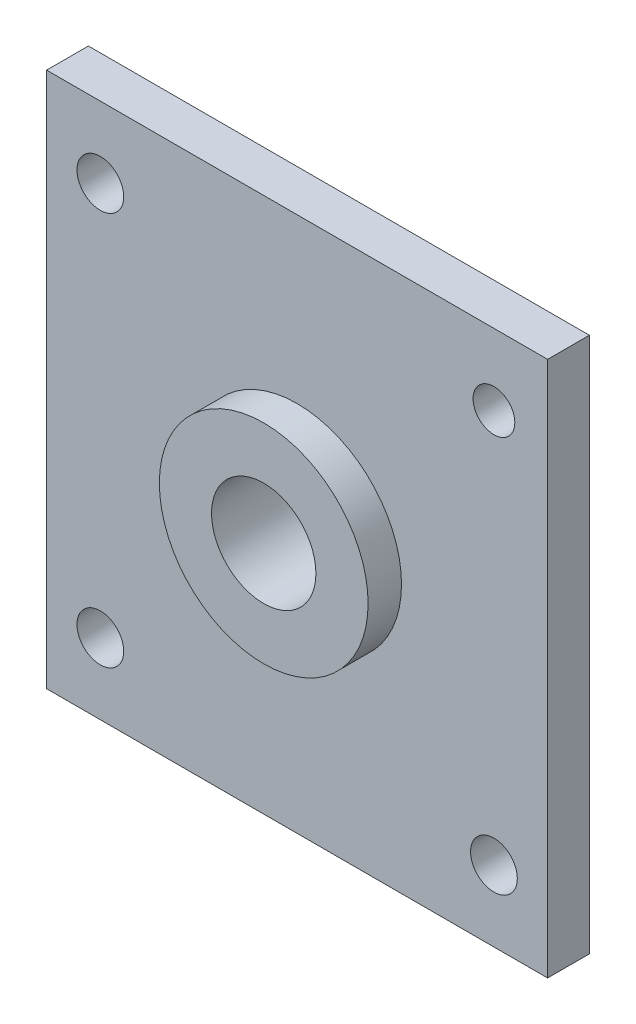
ISO-10303-21;
HEADER;
FILE_DESCRIPTION(('STEP AP214'),'2;1');
FILE_NAME('part.step','',(''),(''),'','','');
FILE_SCHEMA(('AUTOMOTIVE_DESIGN { 1 0 10303 214 1 1 1 1 }'));
ENDSEC;
DATA;
#1=APPLICATION_CONTEXT('core data for automotive mechanical design processes');
#2=APPLICATION_PROTOCOL_DEFINITION('international standard','automotive_design',2000,#1);
#3=PRODUCT_CONTEXT('',#1,'mechanical');
#4=PRODUCT('Part','Part','',(#3));
#5=PRODUCT_RELATED_PRODUCT_CATEGORY('part','',(#4));
#6=PRODUCT_DEFINITION_FORMATION('','',#4);
#7=PRODUCT_DEFINITION_CONTEXT('part definition',#1,'design');
#8=PRODUCT_DEFINITION('design','',#6,#7);
#9=PRODUCT_DEFINITION_SHAPE('','',#8);
#10=(LENGTH_UNIT() NAMED_UNIT(*) SI_UNIT(.MILLI.,.METRE.));
#11=(NAMED_UNIT(*) PLANE_ANGLE_UNIT() SI_UNIT($,.RADIAN.));
#12=(NAMED_UNIT(*) SI_UNIT($,.STERADIAN.) SOLID_ANGLE_UNIT());
#13=UNCERTAINTY_MEASURE_WITH_UNIT(LENGTH_MEASURE(1.E-05),#10,'distance_accuracy_value','');
#14=(GEOMETRIC_REPRESENTATION_CONTEXT(3) GLOBAL_UNCERTAINTY_ASSIGNED_CONTEXT((#13)) GLOBAL_UNIT_ASSIGNED_CONTEXT((#10,
#11,#12)) REPRESENTATION_CONTEXT('',''));
#15=CARTESIAN_POINT('',(0.,0.,0.));
#16=DIRECTION('',(0.,0.,1.));
#17=DIRECTION('',(1.,0.,0.));
#18=AXIS2_PLACEMENT_3D('',#15,#16,#17);
#19=CARTESIAN_POINT('',(34.9999999999999,0.,0.));
#20=DIRECTION('',(1.,0.,0.));
#21=DIRECTION('',(0.,0.,-1.));
#22=AXIS2_PLACEMENT_3D('',#19,#20,#21);
#23=PLANE('',#22);
#24=DIRECTION('',(0.,-1.,0.));
#25=VECTOR('',#24,1.);
#26=CARTESIAN_POINT('',(35.,230.,112.486640647303));
#27=LINE('',#26,#25);
#28=CARTESIAN_POINT('',(35.,350.,112.486640647303));
#29=VERTEX_POINT('',#28);
#30=CARTESIAN_POINT('',(35.000001730934,221.665990817943,112.486640647303));
#31=VERTEX_POINT('',#30);
#32=EDGE_CURVE('E98',#29,#31,#27,.T.);
#33=ORIENTED_EDGE('',*,*,#32,.T.);
#34=DIRECTION('',(0.,0.,1.));
#35=VECTOR('',#34,1.);
#36=CARTESIAN_POINT('',(35.000001730934,221.665990817943,102.486640647303));
#37=LINE('',#36,#35);
#38=CARTESIAN_POINT('',(35.000001730934,221.665990817943,102.486640647303));
#39=VERTEX_POINT('',#38);
#40=EDGE_CURVE('E86',#39,#31,#37,.T.);
#41=ORIENTED_EDGE('',*,*,#40,.F.);
#42=DIRECTION('',(0.,1.,0.));
#43=VECTOR('',#42,1.);
#44=CARTESIAN_POINT('',(35.,230.,102.486640647303));
#45=LINE('',#44,#43);
#46=CARTESIAN_POINT('',(35.,350.,102.486640647303));
#47=VERTEX_POINT('',#46);
#48=EDGE_CURVE('E95',#39,#47,#45,.T.);
#49=ORIENTED_EDGE('',*,*,#48,.T.);
#50=DIRECTION('',(0.,0.,1.));
#51=VECTOR('',#50,1.);
#52=CARTESIAN_POINT('',(35.,350.,102.486640647303));
#53=LINE('',#52,#51);
#54=EDGE_CURVE('E105',#47,#29,#53,.T.);
#55=ORIENTED_EDGE('',*,*,#54,.T.);
#56=EDGE_LOOP('',(#33,#41,#49,#55));
#57=FACE_BOUND('',#56,.T.);
#58=ADVANCED_FACE('F44',(#57),#23,.T.);
#59=CARTESIAN_POINT('',(-85.0000000000001,0.,0.));
#60=DIRECTION('',(1.,0.,0.));
#61=DIRECTION('',(0.,0.,-1.));
#62=AXIS2_PLACEMENT_3D('',#59,#60,#61);
#63=PLANE('',#62);
#64=DIRECTION('',(0.,0.,1.));
#65=VECTOR('',#64,1.);
#66=CARTESIAN_POINT('',(-85.,221.665990817943,102.486640647303));
#67=LINE('',#66,#65);
#68=CARTESIAN_POINT('',(-85.,221.665990817943,102.486640647303));
#69=VERTEX_POINT('',#68);
#70=CARTESIAN_POINT('',(-85.,221.665990817943,112.486640647303));
#71=VERTEX_POINT('',#70);
#72=EDGE_CURVE('E61',#69,#71,#67,.T.);
#73=ORIENTED_EDGE('',*,*,#72,.T.);
#74=DIRECTION('',(0.,1.,0.));
#75=VECTOR('',#74,1.);
#76=CARTESIAN_POINT('',(-85.,230.,112.486640647303));
#77=LINE('',#76,#75);
#78=CARTESIAN_POINT('',(-85.,350.,112.486640647303));
#79=VERTEX_POINT('',#78);
#80=EDGE_CURVE('E12',#71,#79,#77,.T.);
#81=ORIENTED_EDGE('',*,*,#80,.T.);
#82=DIRECTION('',(0.,0.,-1.));
#83=VECTOR('',#82,1.);
#84=CARTESIAN_POINT('',(-85.,350.,102.486640647303));
#85=LINE('',#84,#83);
#86=CARTESIAN_POINT('',(-85.,350.,102.486640647303));
#87=VERTEX_POINT('',#86);
#88=EDGE_CURVE('E53',#79,#87,#85,.T.);
#89=ORIENTED_EDGE('',*,*,#88,.T.);
#90=DIRECTION('',(0.,-1.,0.));
#91=VECTOR('',#90,1.);
#92=CARTESIAN_POINT('',(-85.,230.,102.486640647303));
#93=LINE('',#92,#91);
#94=EDGE_CURVE('E115',#87,#69,#93,.T.);
#95=ORIENTED_EDGE('',*,*,#94,.T.);
#96=EDGE_LOOP('',(#73,#81,#89,#95));
#97=FACE_BOUND('',#96,.T.);
#98=ADVANCED_FACE('F46',(#97),#63,.F.);
#99=CARTESIAN_POINT('',(-218.602419857211,230.,112.486640647303));
#100=DIRECTION('',(0.,0.,1.));
#101=DIRECTION('',(1.,0.,0.));
#102=AXIS2_PLACEMENT_3D('',#99,#100,#101);
#103=PLANE('',#102);
#104=CARTESIAN_POINT('',(-24.999999134533,285.832995408971,112.486640647303));
#105=DIRECTION('',(0.,0.,1.));
#106=DIRECTION('',(1.,0.,0.));
#107=AXIS2_PLACEMENT_3D('',#104,#105,#106);
#108=CIRCLE('',#107,25.);
#109=CARTESIAN_POINT('',(8.65466996680109E-07,285.832995408971,112.486640647303));
#110=VERTEX_POINT('',#109);
#111=EDGE_CURVE('E154',#110,#110,#108,.T.);
#112=ORIENTED_EDGE('',*,*,#111,.F.);
#113=EDGE_LOOP('',(#112));
#114=FACE_BOUND('',#113,.T.);
#115=CARTESIAN_POINT('',(22.1399999999999,238.66,112.486640647303));
#116=DIRECTION('',(0.,0.,1.));
#117=DIRECTION('',(1.,0.,0.));
#118=AXIS2_PLACEMENT_3D('',#115,#116,#117);
#119=CIRCLE('',#118,5.60000000000001);
#120=CARTESIAN_POINT('',(27.7399999999999,238.66,112.486640647303));
#121=VERTEX_POINT('',#120);
#122=EDGE_CURVE('E144',#121,#121,#119,.T.);
#123=ORIENTED_EDGE('',*,*,#122,.F.);
#124=EDGE_LOOP('',(#123));
#125=FACE_BOUND('',#124,.T.);
#126=CARTESIAN_POINT('',(22.1399999999999,332.94,112.486640647303));
#127=DIRECTION('',(0.,0.,1.));
#128=DIRECTION('',(1.,0.,0.));
#129=AXIS2_PLACEMENT_3D('',#126,#127,#128);
#130=CIRCLE('',#129,5.);
#131=CARTESIAN_POINT('',(27.1399999999999,332.94,112.486640647303));
#132=VERTEX_POINT('',#131);
#133=EDGE_CURVE('E121',#132,#132,#130,.T.);
#134=ORIENTED_EDGE('',*,*,#133,.F.);
#135=EDGE_LOOP('',(#134));
#136=FACE_BOUND('',#135,.T.);
#137=CARTESIAN_POINT('',(-72.1400000000001,238.66,112.486640647303));
#138=DIRECTION('',(0.,0.,1.));
#139=DIRECTION('',(1.,0.,0.));
#140=AXIS2_PLACEMENT_3D('',#137,#138,#139);
#141=CIRCLE('',#140,5.60000000000001);
#142=CARTESIAN_POINT('',(-66.5400000000001,238.66,112.486640647303));
#143=VERTEX_POINT('',#142);
#144=EDGE_CURVE('E146',#143,#143,#141,.T.);
#145=ORIENTED_EDGE('',*,*,#144,.F.);
#146=EDGE_LOOP('',(#145));
#147=FACE_BOUND('',#146,.T.);
#148=CARTESIAN_POINT('',(-72.1400000000001,332.94,112.486640647303));
#149=DIRECTION('',(0.,0.,1.));
#150=DIRECTION('',(1.,0.,0.));
#151=AXIS2_PLACEMENT_3D('',#148,#149,#150);
#152=CIRCLE('',#151,5.6);
#153=CARTESIAN_POINT('',(-66.5400000000001,332.94,112.486640647303));
#154=VERTEX_POINT('',#153);
#155=EDGE_CURVE('E151',#154,#154,#152,.T.);
#156=ORIENTED_EDGE('',*,*,#155,.F.);
#157=EDGE_LOOP('',(#156));
#158=FACE_BOUND('',#157,.T.);
#159=ORIENTED_EDGE('',*,*,#80,.F.);
#160=DIRECTION('',(1.,0.,0.));
#161=VECTOR('',#160,1.);
#162=CARTESIAN_POINT('',(-218.602419857211,221.665990817943,112.486640647303));
#163=LINE('',#162,#161);
#164=EDGE_CURVE('E99',#71,#31,#163,.T.);
#165=ORIENTED_EDGE('',*,*,#164,.T.);
#166=ORIENTED_EDGE('',*,*,#32,.F.);
#167=DIRECTION('',(1.,0.,0.));
#168=VECTOR('',#167,1.);
#169=CARTESIAN_POINT('',(-218.602419857211,350.,112.486640647303));
#170=LINE('',#169,#168);
#171=EDGE_CURVE('E113',#79,#29,#170,.T.);
#172=ORIENTED_EDGE('',*,*,#171,.F.);
#173=EDGE_LOOP('',(#159,#165,#166,#172));
#174=FACE_BOUND('',#173,.T.);
#175=ADVANCED_FACE('F132',(#114,#125,#136,#147,#158,#174),#103,.T.);
#176=CARTESIAN_POINT('',(-218.602419857211,230.,102.486640647303));
#177=DIRECTION('',(0.,0.,-1.));
#178=DIRECTION('',(-1.,0.,0.));
#179=AXIS2_PLACEMENT_3D('',#176,#177,#178);
#180=PLANE('',#179);
#181=CARTESIAN_POINT('',(-24.999999134533,285.832995408971,102.486640647303));
#182=DIRECTION('',(0.,0.,1.));
#183=DIRECTION('',(1.,0.,0.));
#184=AXIS2_PLACEMENT_3D('',#181,#182,#183);
#185=CIRCLE('',#184,12.5);
#186=CARTESIAN_POINT('',(-12.499999134533,285.832995408971,102.486640647303));
#187=VERTEX_POINT('',#186);
#188=EDGE_CURVE('E90',#187,#187,#185,.T.);
#189=ORIENTED_EDGE('',*,*,#188,.T.);
#190=EDGE_LOOP('',(#189));
#191=FACE_BOUND('',#190,.T.);
#192=CARTESIAN_POINT('',(22.1399999999999,332.94,102.486640647303));
#193=DIRECTION('',(0.,0.,-1.));
#194=DIRECTION('',(-1.,0.,0.));
#195=AXIS2_PLACEMENT_3D('',#192,#193,#194);
#196=CIRCLE('',#195,5.);
#197=CARTESIAN_POINT('',(17.1399999999999,332.94,102.486640647303));
#198=VERTEX_POINT('',#197);
#199=EDGE_CURVE('E117',#198,#198,#196,.T.);
#200=ORIENTED_EDGE('',*,*,#199,.F.);
#201=EDGE_LOOP('',(#200));
#202=FACE_BOUND('',#201,.T.);
#203=CARTESIAN_POINT('',(-72.1400000000001,332.94,102.486640647303));
#204=DIRECTION('',(0.,0.,-1.));
#205=DIRECTION('',(-1.,0.,0.));
#206=AXIS2_PLACEMENT_3D('',#203,#204,#205);
#207=CIRCLE('',#206,5.6);
#208=CARTESIAN_POINT('',(-77.7400000000001,332.94,102.486640647303));
#209=VERTEX_POINT('',#208);
#210=EDGE_CURVE('E48',#209,#209,#207,.T.);
#211=ORIENTED_EDGE('',*,*,#210,.F.);
#212=EDGE_LOOP('',(#211));
#213=FACE_BOUND('',#212,.T.);
#214=CARTESIAN_POINT('',(-72.1400000000001,238.66,102.486640647303));
#215=DIRECTION('',(0.,0.,-1.));
#216=DIRECTION('',(-1.,0.,0.));
#217=AXIS2_PLACEMENT_3D('',#214,#215,#216);
#218=CIRCLE('',#217,5.60000000000001);
#219=CARTESIAN_POINT('',(-77.7400000000001,238.66,102.486640647303));
#220=VERTEX_POINT('',#219);
#221=EDGE_CURVE('E109',#220,#220,#218,.T.);
#222=ORIENTED_EDGE('',*,*,#221,.F.);
#223=EDGE_LOOP('',(#222));
#224=FACE_BOUND('',#223,.T.);
#225=CARTESIAN_POINT('',(22.1399999999999,238.66,102.486640647303));
#226=DIRECTION('',(0.,0.,-1.));
#227=DIRECTION('',(-1.,0.,0.));
#228=AXIS2_PLACEMENT_3D('',#225,#226,#227);
#229=CIRCLE('',#228,5.60000000000001);
#230=CARTESIAN_POINT('',(16.5399999999999,238.66,102.486640647303));
#231=VERTEX_POINT('',#230);
#232=EDGE_CURVE('E120',#231,#231,#229,.T.);
#233=ORIENTED_EDGE('',*,*,#232,.F.);
#234=EDGE_LOOP('',(#233));
#235=FACE_BOUND('',#234,.T.);
#236=ORIENTED_EDGE('',*,*,#48,.F.);
#237=DIRECTION('',(1.,0.,0.));
#238=VECTOR('',#237,1.);
#239=CARTESIAN_POINT('',(35.000001730934,221.665990817943,102.486640647303));
#240=LINE('',#239,#238);
#241=EDGE_CURVE('E83',#69,#39,#240,.T.);
#242=ORIENTED_EDGE('',*,*,#241,.F.);
#243=ORIENTED_EDGE('',*,*,#94,.F.);
#244=DIRECTION('',(1.,0.,0.));
#245=VECTOR('',#244,1.);
#246=CARTESIAN_POINT('',(-218.602419857211,350.,102.486640647303));
#247=LINE('',#246,#245);
#248=EDGE_CURVE('E103',#87,#47,#247,.T.);
#249=ORIENTED_EDGE('',*,*,#248,.T.);
#250=EDGE_LOOP('',(#236,#242,#243,#249));
#251=FACE_BOUND('',#250,.T.);
#252=ADVANCED_FACE('F101',(#191,#202,#213,#224,#235,#251),#180,.T.);
#253=CARTESIAN_POINT('',(-218.602419857211,350.,102.486640647303));
#254=DIRECTION('',(0.,1.,0.));
#255=DIRECTION('',(-1.,0.,0.));
#256=AXIS2_PLACEMENT_3D('',#253,#254,#255);
#257=PLANE('',#256);
#258=ORIENTED_EDGE('',*,*,#54,.F.);
#259=ORIENTED_EDGE('',*,*,#248,.F.);
#260=ORIENTED_EDGE('',*,*,#88,.F.);
#261=ORIENTED_EDGE('',*,*,#171,.T.);
#262=EDGE_LOOP('',(#258,#259,#260,#261));
#263=FACE_BOUND('',#262,.T.);
#264=ADVANCED_FACE('F131',(#263),#257,.T.);
#265=CARTESIAN_POINT('',(22.1399999999999,332.94,-87.5133593526974));
#266=DIRECTION('',(0.,0.,1.));
#267=DIRECTION('',(1.,0.,0.));
#268=AXIS2_PLACEMENT_3D('',#265,#266,#267);
#269=CYLINDRICAL_SURFACE('',#268,5.);
#270=ORIENTED_EDGE('',*,*,#199,.T.);
#271=EDGE_LOOP('',(#270));
#272=FACE_BOUND('',#271,.T.);
#273=ORIENTED_EDGE('',*,*,#133,.T.);
#274=EDGE_LOOP('',(#273));
#275=FACE_BOUND('',#274,.T.);
#276=ADVANCED_FACE('F140',(#272,#275),#269,.F.);
#277=CARTESIAN_POINT('',(22.1399999999999,238.66,-87.5133593526974));
#278=DIRECTION('',(0.,0.,1.));
#279=DIRECTION('',(1.,0.,0.));
#280=AXIS2_PLACEMENT_3D('',#277,#278,#279);
#281=CYLINDRICAL_SURFACE('',#280,5.60000000000001);
#282=ORIENTED_EDGE('',*,*,#232,.T.);
#283=EDGE_LOOP('',(#282));
#284=FACE_BOUND('',#283,.T.);
#285=ORIENTED_EDGE('',*,*,#122,.T.);
#286=EDGE_LOOP('',(#285));
#287=FACE_BOUND('',#286,.T.);
#288=ADVANCED_FACE('F137',(#284,#287),#281,.F.);
#289=CARTESIAN_POINT('',(-72.1400000000001,238.66,-87.5133593526974));
#290=DIRECTION('',(0.,0.,1.));
#291=DIRECTION('',(1.,0.,0.));
#292=AXIS2_PLACEMENT_3D('',#289,#290,#291);
#293=CYLINDRICAL_SURFACE('',#292,5.60000000000001);
#294=ORIENTED_EDGE('',*,*,#221,.T.);
#295=EDGE_LOOP('',(#294));
#296=FACE_BOUND('',#295,.T.);
#297=ORIENTED_EDGE('',*,*,#144,.T.);
#298=EDGE_LOOP('',(#297));
#299=FACE_BOUND('',#298,.T.);
#300=ADVANCED_FACE('F126',(#296,#299),#293,.F.);
#301=CARTESIAN_POINT('',(-72.1400000000001,332.94,-87.5133593526974));
#302=DIRECTION('',(0.,0.,1.));
#303=DIRECTION('',(1.,0.,0.));
#304=AXIS2_PLACEMENT_3D('',#301,#302,#303);
#305=CYLINDRICAL_SURFACE('',#304,5.6);
#306=ORIENTED_EDGE('',*,*,#210,.T.);
#307=EDGE_LOOP('',(#306));
#308=FACE_BOUND('',#307,.T.);
#309=ORIENTED_EDGE('',*,*,#155,.T.);
#310=EDGE_LOOP('',(#309));
#311=FACE_BOUND('',#310,.T.);
#312=ADVANCED_FACE('F187',(#308,#311),#305,.F.);
#313=CARTESIAN_POINT('',(-24.999999134533,285.832995408971,120.486640647303));
#314=DIRECTION('',(0.,0.,1.));
#315=DIRECTION('',(1.,0.,0.));
#316=AXIS2_PLACEMENT_3D('',#313,#314,#315);
#317=PLANE('',#316);
#318=CARTESIAN_POINT('',(-24.999999134533,285.832995408971,120.486640647303));
#319=DIRECTION('',(0.,0.,1.));
#320=DIRECTION('',(1.,0.,0.));
#321=AXIS2_PLACEMENT_3D('',#318,#319,#320);
#322=CIRCLE('',#321,12.5);
#323=CARTESIAN_POINT('',(-12.499999134533,285.832995408971,120.486640647303));
#324=VERTEX_POINT('',#323);
#325=EDGE_CURVE('E164',#324,#324,#322,.T.);
#326=ORIENTED_EDGE('',*,*,#325,.F.);
#327=EDGE_LOOP('',(#326));
#328=FACE_BOUND('',#327,.T.);
#329=CARTESIAN_POINT('',(-24.999999134533,285.832995408971,120.486640647303));
#330=DIRECTION('',(0.,0.,1.));
#331=DIRECTION('',(1.,0.,0.));
#332=AXIS2_PLACEMENT_3D('',#329,#330,#331);
#333=CIRCLE('',#332,25.);
#334=CARTESIAN_POINT('',(8.65466996680109E-07,285.832995408971,120.486640647303));
#335=VERTEX_POINT('',#334);
#336=EDGE_CURVE('E158',#335,#335,#333,.T.);
#337=ORIENTED_EDGE('',*,*,#336,.T.);
#338=EDGE_LOOP('',(#337));
#339=FACE_BOUND('',#338,.T.);
#340=ADVANCED_FACE('F189',(#328,#339),#317,.T.);
#341=CARTESIAN_POINT('',(-24.999999134533,285.832995408971,120.486640647303));
#342=DIRECTION('',(0.,0.,-1.));
#343=DIRECTION('',(-1.,0.,0.));
#344=AXIS2_PLACEMENT_3D('',#341,#342,#343);
#345=CYLINDRICAL_SURFACE('',#344,25.);
#346=ORIENTED_EDGE('',*,*,#111,.T.);
#347=EDGE_LOOP('',(#346));
#348=FACE_BOUND('',#347,.T.);
#349=ORIENTED_EDGE('',*,*,#336,.F.);
#350=EDGE_LOOP('',(#349));
#351=FACE_BOUND('',#350,.T.);
#352=ADVANCED_FACE('F175',(#348,#351),#345,.T.);
#353=CARTESIAN_POINT('',(-24.999999134533,285.832995408971,120.486640647303));
#354=DIRECTION('',(0.,0.,-1.));
#355=DIRECTION('',(-1.,0.,0.));
#356=AXIS2_PLACEMENT_3D('',#353,#354,#355);
#357=CYLINDRICAL_SURFACE('',#356,12.5);
#358=ORIENTED_EDGE('',*,*,#325,.T.);
#359=EDGE_LOOP('',(#358));
#360=FACE_BOUND('',#359,.T.);
#361=ORIENTED_EDGE('',*,*,#188,.F.);
#362=EDGE_LOOP('',(#361));
#363=FACE_BOUND('',#362,.T.);
#364=ADVANCED_FACE('F252',(#360,#363),#357,.F.);
#365=CARTESIAN_POINT('',(35.000001730934,221.665990817943,102.486640647303));
#366=DIRECTION('',(0.,-1.,0.));
#367=DIRECTION('',(0.,0.,-1.));
#368=AXIS2_PLACEMENT_3D('',#365,#366,#367);
#369=PLANE('',#368);
#370=ORIENTED_EDGE('',*,*,#72,.F.);
#371=ORIENTED_EDGE('',*,*,#241,.T.);
#372=ORIENTED_EDGE('',*,*,#40,.T.);
#373=ORIENTED_EDGE('',*,*,#164,.F.);
#374=EDGE_LOOP('',(#370,#371,#372,#373));
#375=FACE_BOUND('',#374,.T.);
#376=ADVANCED_FACE('F85',(#375),#369,.T.);
#377=CLOSED_SHELL('',(#58,#98,#175,#252,#264,#276,#288,#300,#312,#340,#352,#364,#376));
#378=MANIFOLD_SOLID_BREP('B2',#377);
#379=ADVANCED_BREP_SHAPE_REPRESENTATION('',(#18,#378),#14);
#380=SHAPE_DEFINITION_REPRESENTATION(#9,#379);
ENDSEC;
END-ISO-10303-21;
